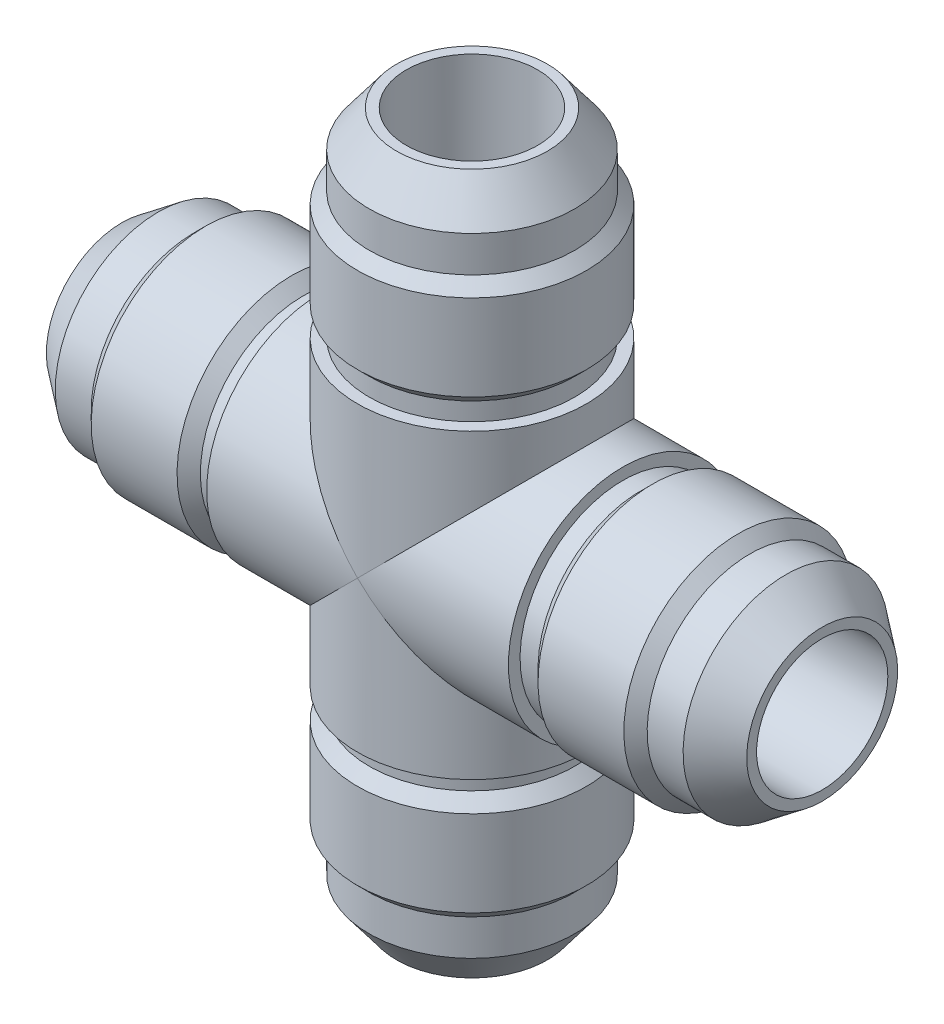
ISO-10303-21;
HEADER;
FILE_DESCRIPTION(('STEP AP214'),'2;1');
FILE_NAME('part.step','',(''),(''),'','','');
FILE_SCHEMA(('AUTOMOTIVE_DESIGN { 1 0 10303 214 1 1 1 1 }'));
ENDSEC;
DATA;
#1=APPLICATION_CONTEXT('core data for automotive mechanical design processes');
#2=APPLICATION_PROTOCOL_DEFINITION('international standard','automotive_design',2000,#1);
#3=PRODUCT_CONTEXT('',#1,'mechanical');
#4=PRODUCT('Part','Part','',(#3));
#5=PRODUCT_RELATED_PRODUCT_CATEGORY('part','',(#4));
#6=PRODUCT_DEFINITION_FORMATION('','',#4);
#7=PRODUCT_DEFINITION_CONTEXT('part definition',#1,'design');
#8=PRODUCT_DEFINITION('design','',#6,#7);
#9=PRODUCT_DEFINITION_SHAPE('','',#8);
#10=(LENGTH_UNIT() NAMED_UNIT(*) SI_UNIT(.MILLI.,.METRE.));
#11=(NAMED_UNIT(*) PLANE_ANGLE_UNIT() SI_UNIT($,.RADIAN.));
#12=(NAMED_UNIT(*) SI_UNIT($,.STERADIAN.) SOLID_ANGLE_UNIT());
#13=UNCERTAINTY_MEASURE_WITH_UNIT(LENGTH_MEASURE(1.E-05),#10,'distance_accuracy_value','');
#14=(GEOMETRIC_REPRESENTATION_CONTEXT(3) GLOBAL_UNCERTAINTY_ASSIGNED_CONTEXT((#13)) GLOBAL_UNIT_ASSIGNED_CONTEXT((#10,
#11,#12)) REPRESENTATION_CONTEXT('',''));
#15=CARTESIAN_POINT('',(0.,0.,0.));
#16=DIRECTION('',(0.,0.,1.));
#17=DIRECTION('',(1.,0.,0.));
#18=AXIS2_PLACEMENT_3D('',#15,#16,#17);
#19=CARTESIAN_POINT('',(41.275,0.,0.));
#20=DIRECTION('',(-1.,0.,0.));
#21=DIRECTION('',(0.,0.,1.));
#22=AXIS2_PLACEMENT_3D('',#19,#20,#21);
#23=CYLINDRICAL_SURFACE('',#22,7.7343);
#24=CARTESIAN_POINT('',(-41.275,0.,0.));
#25=DIRECTION('',(1.,0.,0.));
#26=DIRECTION('',(0.,0.,-1.));
#27=AXIS2_PLACEMENT_3D('',#24,#25,#26);
#28=CIRCLE('',#27,7.7343);
#29=CARTESIAN_POINT('',(-41.275,0.,-7.7343));
#30=VERTEX_POINT('',#29);
#31=EDGE_CURVE('E143',#30,#30,#28,.T.);
#32=ORIENTED_EDGE('',*,*,#31,.F.);
#33=EDGE_LOOP('',(#32));
#34=FACE_BOUND('',#33,.T.);
#35=CARTESIAN_POINT('',(0.,0.,0.));
#36=DIRECTION('',(-0.707106781186549,-0.707106781186546,0.));
#37=DIRECTION('',(-0.707106781186546,0.707106781186549,0.));
#38=AXIS2_PLACEMENT_3D('',#35,#36,#37);
#39=ELLIPSE('',#38,10.9379519554622,7.7343);
#40=CARTESIAN_POINT('',(1.44913832121401E-13,0.,-7.7343));
#41=VERTEX_POINT('',#40);
#42=CARTESIAN_POINT('',(0.,0.,7.7343));
#43=VERTEX_POINT('',#42);
#44=EDGE_CURVE('E73',#41,#43,#39,.F.);
#45=ORIENTED_EDGE('',*,*,#44,.T.);
#46=CARTESIAN_POINT('',(1.44913832121401E-13,0.,0.));
#47=DIRECTION('',(-0.707106781186547,0.707106781186547,0.));
#48=DIRECTION('',(-0.707106781186547,-0.707106781186547,0.));
#49=AXIS2_PLACEMENT_3D('',#46,#47,#48);
#50=ELLIPSE('',#49,10.9379519554622,7.7343);
#51=EDGE_CURVE('E11',#43,#41,#50,.F.);
#52=ORIENTED_EDGE('',*,*,#51,.T.);
#53=EDGE_LOOP('',(#45,#52));
#54=FACE_BOUND('',#53,.T.);
#55=ADVANCED_FACE('F42',(#34,#54),#23,.F.);
#56=CARTESIAN_POINT('',(0.,0.,0.));
#57=DIRECTION('',(0.,1.,0.));
#58=DIRECTION('',(0.,0.,1.));
#59=AXIS2_PLACEMENT_3D('',#56,#57,#58);
#60=CYLINDRICAL_SURFACE('',#59,13.49375);
#61=CARTESIAN_POINT('',(0.,17.78,0.));
#62=DIRECTION('',(0.,-1.,0.));
#63=DIRECTION('',(0.,0.,-1.));
#64=AXIS2_PLACEMENT_3D('',#61,#62,#63);
#65=CIRCLE('',#64,13.49375);
#66=CARTESIAN_POINT('',(0.,17.78,-13.49375));
#67=VERTEX_POINT('',#66);
#68=EDGE_CURVE('E176',#67,#67,#65,.T.);
#69=ORIENTED_EDGE('',*,*,#68,.T.);
#70=EDGE_LOOP('',(#69));
#71=FACE_BOUND('',#70,.T.);
#72=CARTESIAN_POINT('',(0.,0.,0.));
#73=DIRECTION('',(-0.707106781186546,0.707106781186549,0.));
#74=DIRECTION('',(0.707106781186549,0.707106781186546,0.));
#75=AXIS2_PLACEMENT_3D('',#72,#73,#74);
#76=ELLIPSE('',#75,19.083044257272,13.49375);
#77=CARTESIAN_POINT('',(0.,0.,-13.49375));
#78=VERTEX_POINT('',#77);
#79=CARTESIAN_POINT('',(0.,0.,13.49375));
#80=VERTEX_POINT('',#79);
#81=EDGE_CURVE('E171',#78,#80,#76,.F.);
#82=ORIENTED_EDGE('',*,*,#81,.F.);
#83=CARTESIAN_POINT('',(0.,0.,0.));
#84=DIRECTION('',(0.707106781186549,0.707106781186546,0.));
#85=DIRECTION('',(-0.707106781186546,0.707106781186549,0.));
#86=AXIS2_PLACEMENT_3D('',#83,#84,#85);
#87=ELLIPSE('',#86,19.0830442572719,13.49375);
#88=EDGE_CURVE('E61',#80,#78,#87,.F.);
#89=ORIENTED_EDGE('',*,*,#88,.F.);
#90=EDGE_LOOP('',(#82,#89));
#91=FACE_BOUND('',#90,.T.);
#92=ADVANCED_FACE('F226',(#71,#91),#60,.T.);
#93=CARTESIAN_POINT('',(1.4411089226075E-13,41.275,0.));
#94=DIRECTION('',(0.,-1.,0.));
#95=DIRECTION('',(0.,0.,-1.));
#96=AXIS2_PLACEMENT_3D('',#93,#94,#95);
#97=CYLINDRICAL_SURFACE('',#96,7.7343);
#98=CARTESIAN_POINT('',(1.4411089226075E-13,41.275,0.));
#99=DIRECTION('',(0.,-1.,0.));
#100=DIRECTION('',(0.,0.,-1.));
#101=AXIS2_PLACEMENT_3D('',#98,#99,#100);
#102=CIRCLE('',#101,7.7343);
#103=CARTESIAN_POINT('',(1.4411089226075E-13,41.275,-7.7343));
#104=VERTEX_POINT('',#103);
#105=EDGE_CURVE('E173',#104,#104,#102,.T.);
#106=ORIENTED_EDGE('',*,*,#105,.F.);
#107=EDGE_LOOP('',(#106));
#108=FACE_BOUND('',#107,.T.);
#109=ORIENTED_EDGE('',*,*,#44,.F.);
#110=CARTESIAN_POINT('',(0.,0.,0.));
#111=DIRECTION('',(-0.707106781186546,0.707106781186549,0.));
#112=DIRECTION('',(-0.707106781186549,-0.707106781186546,0.));
#113=AXIS2_PLACEMENT_3D('',#110,#111,#112);
#114=ELLIPSE('',#113,10.9379519554622,7.7343);
#115=EDGE_CURVE('E77',#43,#41,#114,.T.);
#116=ORIENTED_EDGE('',*,*,#115,.F.);
#117=EDGE_LOOP('',(#109,#116));
#118=FACE_BOUND('',#117,.T.);
#119=ADVANCED_FACE('F76',(#108,#118),#97,.F.);
#120=CARTESIAN_POINT('',(0.,17.78,0.));
#121=DIRECTION('',(0.,1.,0.));
#122=DIRECTION('',(0.,0.,1.));
#123=AXIS2_PLACEMENT_3D('',#120,#121,#122);
#124=CYLINDRICAL_SURFACE('',#123,13.49375);
#125=CARTESIAN_POINT('',(0.,21.2714819951745,0.));
#126=DIRECTION('',(0.,-1.,0.));
#127=DIRECTION('',(1.,0.,0.));
#128=AXIS2_PLACEMENT_3D('',#125,#126,#127);
#129=CIRCLE('',#128,13.49375);
#130=CARTESIAN_POINT('',(13.4937500000001,21.2714819951744,0.));
#131=VERTEX_POINT('',#130);
#132=EDGE_CURVE('E179',#131,#131,#129,.T.);
#133=ORIENTED_EDGE('',*,*,#132,.F.);
#134=EDGE_LOOP('',(#133));
#135=FACE_BOUND('',#134,.T.);
#136=CARTESIAN_POINT('',(1.0652756648338E-13,31.3878090172366,0.));
#137=DIRECTION('',(0.,-1.,0.));
#138=DIRECTION('',(1.,0.,0.));
#139=AXIS2_PLACEMENT_3D('',#136,#137,#138);
#140=CIRCLE('',#139,13.49375);
#141=CARTESIAN_POINT('',(13.4937500000001,31.3878090172366,0.));
#142=VERTEX_POINT('',#141);
#143=EDGE_CURVE('E188',#142,#142,#140,.T.);
#144=ORIENTED_EDGE('',*,*,#143,.T.);
#145=EDGE_LOOP('',(#144));
#146=FACE_BOUND('',#145,.T.);
#147=ADVANCED_FACE('F44',(#135,#146),#124,.T.);
#148=CARTESIAN_POINT('',(1.11193573315191E-13,32.7626243457444,0.));
#149=DIRECTION('',(0.,-1.,0.));
#150=DIRECTION('',(1.,0.,0.));
#151=AXIS2_PLACEMENT_3D('',#148,#149,#150);
#152=CONICAL_SURFACE('',#151,12.1189346714922,0.78539816339745);
#153=ORIENTED_EDGE('',*,*,#143,.F.);
#154=EDGE_LOOP('',(#153));
#155=FACE_BOUND('',#154,.T.);
#156=CARTESIAN_POINT('',(1.11193573315191E-13,32.7626243457444,0.));
#157=DIRECTION('',(0.,-1.,0.));
#158=DIRECTION('',(1.,0.,0.));
#159=AXIS2_PLACEMENT_3D('',#156,#157,#158);
#160=CIRCLE('',#159,12.1189346714922);
#161=CARTESIAN_POINT('',(12.1189346714923,32.7626243457444,0.));
#162=VERTEX_POINT('',#161);
#163=EDGE_CURVE('E70',#162,#162,#160,.T.);
#164=ORIENTED_EDGE('',*,*,#163,.T.);
#165=EDGE_LOOP('',(#164));
#166=FACE_BOUND('',#165,.T.);
#167=ADVANCED_FACE('F200',(#155,#166),#152,.T.);
#168=CARTESIAN_POINT('',(0.,0.,0.));
#169=DIRECTION('',(0.,-1.,0.));
#170=DIRECTION('',(1.,0.,0.));
#171=AXIS2_PLACEMENT_3D('',#168,#169,#170);
#172=CYLINDRICAL_SURFACE('',#171,12.1189346714922);
#173=ORIENTED_EDGE('',*,*,#163,.F.);
#174=EDGE_LOOP('',(#173));
#175=FACE_BOUND('',#174,.T.);
#176=CARTESIAN_POINT('',(1.25561148250585E-13,36.9959576790777,0.));
#177=DIRECTION('',(0.,-1.,0.));
#178=DIRECTION('',(1.,0.,0.));
#179=AXIS2_PLACEMENT_3D('',#176,#177,#178);
#180=CIRCLE('',#179,12.1189346714922);
#181=CARTESIAN_POINT('',(12.1189346714923,36.9959576790777,0.));
#182=VERTEX_POINT('',#181);
#183=EDGE_CURVE('E194',#182,#182,#180,.T.);
#184=ORIENTED_EDGE('',*,*,#183,.T.);
#185=EDGE_LOOP('',(#184));
#186=FACE_BOUND('',#185,.T.);
#187=ADVANCED_FACE('F202',(#175,#186),#172,.T.);
#188=CARTESIAN_POINT('',(1.4008385562009E-13,41.275,0.));
#189=DIRECTION('',(0.,-1.,0.));
#190=DIRECTION('',(1.,0.,0.));
#191=AXIS2_PLACEMENT_3D('',#188,#189,#190);
#192=CONICAL_SURFACE('',#191,8.894445,0.645771823237897);
#193=ORIENTED_EDGE('',*,*,#183,.F.);
#194=EDGE_LOOP('',(#193));
#195=FACE_BOUND('',#194,.T.);
#196=CARTESIAN_POINT('',(1.4008385562009E-13,41.275,0.));
#197=DIRECTION('',(0.,-1.,0.));
#198=DIRECTION('',(1.,0.,0.));
#199=AXIS2_PLACEMENT_3D('',#196,#197,#198);
#200=CIRCLE('',#199,8.894445);
#201=CARTESIAN_POINT('',(8.89444500000014,41.275,0.));
#202=VERTEX_POINT('',#201);
#203=EDGE_CURVE('E191',#202,#202,#200,.T.);
#204=ORIENTED_EDGE('',*,*,#203,.T.);
#205=EDGE_LOOP('',(#204));
#206=FACE_BOUND('',#205,.T.);
#207=ADVANCED_FACE('F205',(#195,#206),#192,.T.);
#208=CARTESIAN_POINT('',(1.4411089226075E-13,41.275,0.));
#209=DIRECTION('',(0.,-1.,0.));
#210=DIRECTION('',(0.,0.,-1.));
#211=AXIS2_PLACEMENT_3D('',#208,#209,#210);
#212=PLANE('',#211);
#213=ORIENTED_EDGE('',*,*,#105,.T.);
#214=EDGE_LOOP('',(#213));
#215=FACE_BOUND('',#214,.T.);
#216=ORIENTED_EDGE('',*,*,#203,.F.);
#217=EDGE_LOOP('',(#216));
#218=FACE_BOUND('',#217,.T.);
#219=ADVANCED_FACE('F211',(#215,#218),#212,.F.);
#220=CARTESIAN_POINT('',(0.,0.,0.));
#221=DIRECTION('',(0.,-1.,0.));
#222=DIRECTION('',(1.,0.,0.));
#223=AXIS2_PLACEMENT_3D('',#220,#221,#222);
#224=CYLINDRICAL_SURFACE('',#223,12.1189346714922);
#225=CARTESIAN_POINT('',(0.,17.78,0.));
#226=DIRECTION('',(0.,-1.,0.));
#227=DIRECTION('',(1.,0.,0.));
#228=AXIS2_PLACEMENT_3D('',#225,#226,#227);
#229=CIRCLE('',#228,12.1189346714922);
#230=CARTESIAN_POINT('',(12.1189346714922,17.78,0.));
#231=VERTEX_POINT('',#230);
#232=EDGE_CURVE('E185',#231,#231,#229,.T.);
#233=ORIENTED_EDGE('',*,*,#232,.F.);
#234=EDGE_LOOP('',(#233));
#235=FACE_BOUND('',#234,.T.);
#236=CARTESIAN_POINT('',(0.,19.8966666666667,0.));
#237=DIRECTION('',(0.,-1.,0.));
#238=DIRECTION('',(1.,0.,0.));
#239=AXIS2_PLACEMENT_3D('',#236,#237,#238);
#240=CIRCLE('',#239,12.1189346714922);
#241=CARTESIAN_POINT('',(12.1189346714922,19.8966666666666,0.));
#242=VERTEX_POINT('',#241);
#243=EDGE_CURVE('E182',#242,#242,#240,.T.);
#244=ORIENTED_EDGE('',*,*,#243,.T.);
#245=EDGE_LOOP('',(#244));
#246=FACE_BOUND('',#245,.T.);
#247=ADVANCED_FACE('F216',(#235,#246),#224,.T.);
#248=CARTESIAN_POINT('',(0.,21.2714819951745,0.));
#249=DIRECTION('',(0.,1.,0.));
#250=DIRECTION('',(-1.,0.,0.));
#251=AXIS2_PLACEMENT_3D('',#248,#249,#250);
#252=CONICAL_SURFACE('',#251,13.49375,0.78539816339745);
#253=ORIENTED_EDGE('',*,*,#243,.F.);
#254=EDGE_LOOP('',(#253));
#255=FACE_BOUND('',#254,.T.);
#256=ORIENTED_EDGE('',*,*,#132,.T.);
#257=EDGE_LOOP('',(#256));
#258=FACE_BOUND('',#257,.T.);
#259=ADVANCED_FACE('F221',(#255,#258),#252,.T.);
#260=CARTESIAN_POINT('',(0.,17.78,0.));
#261=DIRECTION('',(0.,-1.,0.));
#262=DIRECTION('',(0.,0.,-1.));
#263=AXIS2_PLACEMENT_3D('',#260,#261,#262);
#264=PLANE('',#263);
#265=ORIENTED_EDGE('',*,*,#68,.F.);
#266=EDGE_LOOP('',(#265));
#267=FACE_BOUND('',#266,.T.);
#268=ORIENTED_EDGE('',*,*,#232,.T.);
#269=EDGE_LOOP('',(#268));
#270=FACE_BOUND('',#269,.T.);
#271=ADVANCED_FACE('F455',(#267,#270),#264,.F.);
#272=CARTESIAN_POINT('',(-1.82766167661939E-13,-17.78,0.));
#273=DIRECTION('',(0.,1.,0.));
#274=DIRECTION('',(0.,0.,-1.));
#275=AXIS2_PLACEMENT_3D('',#272,#273,#274);
#276=PLANE('',#275);
#277=CARTESIAN_POINT('',(-1.82766167661939E-13,-17.78,0.));
#278=DIRECTION('',(0.,1.,0.));
#279=DIRECTION('',(0.,0.,-1.));
#280=AXIS2_PLACEMENT_3D('',#277,#278,#279);
#281=CIRCLE('',#280,13.49375);
#282=CARTESIAN_POINT('',(-1.82766167661939E-13,-17.78,-13.49375));
#283=VERTEX_POINT('',#282);
#284=EDGE_CURVE('E84',#283,#283,#281,.T.);
#285=ORIENTED_EDGE('',*,*,#284,.F.);
#286=EDGE_LOOP('',(#285));
#287=FACE_BOUND('',#286,.T.);
#288=CARTESIAN_POINT('',(-1.84500891137916E-13,-17.78,0.));
#289=DIRECTION('',(0.,1.,0.));
#290=DIRECTION('',(-1.,0.,0.));
#291=AXIS2_PLACEMENT_3D('',#288,#289,#290);
#292=CIRCLE('',#291,12.1189346714922);
#293=CARTESIAN_POINT('',(-12.1189346714924,-17.7799999999999,0.));
#294=VERTEX_POINT('',#293);
#295=EDGE_CURVE('E95',#294,#294,#292,.T.);
#296=ORIENTED_EDGE('',*,*,#295,.T.);
#297=EDGE_LOOP('',(#296));
#298=FACE_BOUND('',#297,.T.);
#299=ADVANCED_FACE('F465',(#287,#298),#276,.F.);
#300=CARTESIAN_POINT('',(-2.2073157389954E-13,-21.2714819951745,0.));
#301=DIRECTION('',(0.,-1.,0.));
#302=DIRECTION('',(1.,0.,0.));
#303=AXIS2_PLACEMENT_3D('',#300,#301,#302);
#304=CONICAL_SURFACE('',#303,13.49375,0.78539816339745);
#305=CARTESIAN_POINT('',(-2.06465282940049E-13,-19.8966666666667,0.));
#306=DIRECTION('',(0.,1.,0.));
#307=DIRECTION('',(-1.,0.,0.));
#308=AXIS2_PLACEMENT_3D('',#305,#306,#307);
#309=CIRCLE('',#308,12.1189346714922);
#310=CARTESIAN_POINT('',(-12.1189346714924,-19.8966666666665,0.));
#311=VERTEX_POINT('',#310);
#312=EDGE_CURVE('E92',#311,#311,#309,.T.);
#313=ORIENTED_EDGE('',*,*,#312,.F.);
#314=EDGE_LOOP('',(#313));
#315=FACE_BOUND('',#314,.T.);
#316=CARTESIAN_POINT('',(-2.2073157389954E-13,-21.2714819951745,0.));
#317=DIRECTION('',(0.,1.,0.));
#318=DIRECTION('',(-1.,0.,0.));
#319=AXIS2_PLACEMENT_3D('',#316,#317,#318);
#320=CIRCLE('',#319,13.49375);
#321=CARTESIAN_POINT('',(-13.4937500000002,-21.2714819951743,0.));
#322=VERTEX_POINT('',#321);
#323=EDGE_CURVE('E89',#322,#322,#320,.T.);
#324=ORIENTED_EDGE('',*,*,#323,.T.);
#325=EDGE_LOOP('',(#324));
#326=FACE_BOUND('',#325,.T.);
#327=ADVANCED_FACE('F482',(#315,#326),#304,.T.);
#328=CARTESIAN_POINT('',(0.,0.,0.));
#329=DIRECTION('',(0.,1.,0.));
#330=DIRECTION('',(-1.,0.,0.));
#331=AXIS2_PLACEMENT_3D('',#328,#329,#330);
#332=CYLINDRICAL_SURFACE('',#331,12.1189346714922);
#333=ORIENTED_EDGE('',*,*,#295,.F.);
#334=EDGE_LOOP('',(#333));
#335=FACE_BOUND('',#334,.T.);
#336=ORIENTED_EDGE('',*,*,#312,.T.);
#337=EDGE_LOOP('',(#336));
#338=FACE_BOUND('',#337,.T.);
#339=ADVANCED_FACE('F491',(#335,#338),#332,.T.);
#340=CARTESIAN_POINT('',(-4.32332676782251E-13,-41.275,0.));
#341=DIRECTION('',(0.,1.,0.));
#342=DIRECTION('',(0.,0.,-1.));
#343=AXIS2_PLACEMENT_3D('',#340,#341,#342);
#344=PLANE('',#343);
#345=CARTESIAN_POINT('',(-4.32332676782251E-13,-41.275,0.));
#346=DIRECTION('',(0.,1.,0.));
#347=DIRECTION('',(0.,0.,-1.));
#348=AXIS2_PLACEMENT_3D('',#345,#346,#347);
#349=CIRCLE('',#348,7.7343);
#350=CARTESIAN_POINT('',(-4.32332676782251E-13,-41.275,-7.7343));
#351=VERTEX_POINT('',#350);
#352=EDGE_CURVE('E81',#351,#351,#349,.T.);
#353=ORIENTED_EDGE('',*,*,#352,.T.);
#354=EDGE_LOOP('',(#353));
#355=FACE_BOUND('',#354,.T.);
#356=CARTESIAN_POINT('',(-4.2830564014159E-13,-41.275,0.));
#357=DIRECTION('',(0.,1.,0.));
#358=DIRECTION('',(-1.,0.,0.));
#359=AXIS2_PLACEMENT_3D('',#356,#357,#358);
#360=CIRCLE('',#359,8.894445);
#361=CARTESIAN_POINT('',(-8.89444500000043,-41.2749999999999,0.));
#362=VERTEX_POINT('',#361);
#363=EDGE_CURVE('E101',#362,#362,#360,.T.);
#364=ORIENTED_EDGE('',*,*,#363,.F.);
#365=EDGE_LOOP('',(#364));
#366=FACE_BOUND('',#365,.T.);
#367=ADVANCED_FACE('F501',(#355,#366),#344,.F.);
#368=CARTESIAN_POINT('',(-4.2830564014159E-13,-41.275,0.));
#369=DIRECTION('',(0.,1.,0.));
#370=DIRECTION('',(-1.,0.,0.));
#371=AXIS2_PLACEMENT_3D('',#368,#369,#370);
#372=CONICAL_SURFACE('',#371,8.894445,0.645771823237897);
#373=CARTESIAN_POINT('',(-3.83902539948845E-13,-36.9959576790777,0.));
#374=DIRECTION('',(0.,1.,0.));
#375=DIRECTION('',(-1.,0.,0.));
#376=AXIS2_PLACEMENT_3D('',#373,#374,#375);
#377=CIRCLE('',#376,12.1189346714922);
#378=CARTESIAN_POINT('',(-12.1189346714926,-36.9959576790776,0.));
#379=VERTEX_POINT('',#378);
#380=EDGE_CURVE('E104',#379,#379,#377,.T.);
#381=ORIENTED_EDGE('',*,*,#380,.F.);
#382=EDGE_LOOP('',(#381));
#383=FACE_BOUND('',#382,.T.);
#384=ORIENTED_EDGE('',*,*,#363,.T.);
#385=EDGE_LOOP('',(#384));
#386=FACE_BOUND('',#385,.T.);
#387=ADVANCED_FACE('F511',(#383,#386),#372,.T.);
#388=CARTESIAN_POINT('',(0.,0.,0.));
#389=DIRECTION('',(0.,1.,0.));
#390=DIRECTION('',(-1.,0.,0.));
#391=AXIS2_PLACEMENT_3D('',#388,#389,#390);
#392=CYLINDRICAL_SURFACE('',#391,12.1189346714922);
#393=CARTESIAN_POINT('',(-3.3997375634458E-13,-32.7626243457444,0.));
#394=DIRECTION('',(0.,1.,0.));
#395=DIRECTION('',(-1.,0.,0.));
#396=AXIS2_PLACEMENT_3D('',#393,#394,#395);
#397=CIRCLE('',#396,12.1189346714922);
#398=CARTESIAN_POINT('',(-12.1189346714925,-32.7626243457443,0.));
#399=VERTEX_POINT('',#398);
#400=EDGE_CURVE('E107',#399,#399,#397,.T.);
#401=ORIENTED_EDGE('',*,*,#400,.F.);
#402=EDGE_LOOP('',(#401));
#403=FACE_BOUND('',#402,.T.);
#404=ORIENTED_EDGE('',*,*,#380,.T.);
#405=EDGE_LOOP('',(#404));
#406=FACE_BOUND('',#405,.T.);
#407=ADVANCED_FACE('F521',(#403,#406),#392,.T.);
#408=CARTESIAN_POINT('',(-3.3997375634458E-13,-32.7626243457444,0.));
#409=DIRECTION('',(0.,1.,0.));
#410=DIRECTION('',(-1.,0.,0.));
#411=AXIS2_PLACEMENT_3D('',#408,#409,#410);
#412=CONICAL_SURFACE('',#411,12.1189346714922,0.78539816339745);
#413=CARTESIAN_POINT('',(-3.25707465385088E-13,-31.3878090172366,0.));
#414=DIRECTION('',(0.,1.,0.));
#415=DIRECTION('',(-1.,0.,0.));
#416=AXIS2_PLACEMENT_3D('',#413,#414,#415);
#417=CIRCLE('',#416,13.49375);
#418=CARTESIAN_POINT('',(-13.4937500000003,-31.3878090172365,0.));
#419=VERTEX_POINT('',#418);
#420=EDGE_CURVE('E98',#419,#419,#417,.T.);
#421=ORIENTED_EDGE('',*,*,#420,.F.);
#422=EDGE_LOOP('',(#421));
#423=FACE_BOUND('',#422,.T.);
#424=ORIENTED_EDGE('',*,*,#400,.T.);
#425=EDGE_LOOP('',(#424));
#426=FACE_BOUND('',#425,.T.);
#427=ADVANCED_FACE('F531',(#423,#426),#412,.T.);
#428=CARTESIAN_POINT('',(-1.86235614613893E-13,-17.78,0.));
#429=DIRECTION('',(0.,-1.,0.));
#430=DIRECTION('',(0.,0.,1.));
#431=AXIS2_PLACEMENT_3D('',#428,#429,#430);
#432=CYLINDRICAL_SURFACE('',#431,13.49375);
#433=ORIENTED_EDGE('',*,*,#323,.F.);
#434=EDGE_LOOP('',(#433));
#435=FACE_BOUND('',#434,.T.);
#436=ORIENTED_EDGE('',*,*,#420,.T.);
#437=EDGE_LOOP('',(#436));
#438=FACE_BOUND('',#437,.T.);
#439=ADVANCED_FACE('F541',(#435,#438),#432,.T.);
#440=CARTESIAN_POINT('',(17.78,-1.20687629457308E-13,0.));
#441=DIRECTION('',(-1.,0.,0.));
#442=DIRECTION('',(0.,0.,-1.));
#443=AXIS2_PLACEMENT_3D('',#440,#441,#442);
#444=PLANE('',#443);
#445=CARTESIAN_POINT('',(17.78,-1.20687629457308E-13,0.));
#446=DIRECTION('',(-1.,0.,0.));
#447=DIRECTION('',(0.,0.,-1.));
#448=AXIS2_PLACEMENT_3D('',#445,#446,#447);
#449=CIRCLE('',#448,13.49375);
#450=CARTESIAN_POINT('',(17.78,-1.20687629457308E-13,-13.49375));
#451=VERTEX_POINT('',#450);
#452=EDGE_CURVE('E116',#451,#451,#449,.T.);
#453=ORIENTED_EDGE('',*,*,#452,.F.);
#454=EDGE_LOOP('',(#453));
#455=FACE_BOUND('',#454,.T.);
#456=CARTESIAN_POINT('',(17.78,-1.22422352933285E-13,0.));
#457=DIRECTION('',(-1.,0.,0.));
#458=DIRECTION('',(0.,-1.,0.));
#459=AXIS2_PLACEMENT_3D('',#456,#457,#458);
#460=CIRCLE('',#459,12.1189346714922);
#461=CARTESIAN_POINT('',(17.7799999999999,-12.1189346714923,0.));
#462=VERTEX_POINT('',#461);
#463=EDGE_CURVE('E125',#462,#462,#460,.T.);
#464=ORIENTED_EDGE('',*,*,#463,.T.);
#465=EDGE_LOOP('',(#464));
#466=FACE_BOUND('',#465,.T.);
#467=ADVANCED_FACE('F551',(#455,#466),#444,.F.);
#468=CARTESIAN_POINT('',(21.2714819951745,-1.46462591463851E-13,0.));
#469=DIRECTION('',(1.,0.,0.));
#470=DIRECTION('',(0.,1.,0.));
#471=AXIS2_PLACEMENT_3D('',#468,#469,#470);
#472=CONICAL_SURFACE('',#471,13.49375,0.78539816339745);
#473=CARTESIAN_POINT('',(19.8966666666667,-1.369964425682E-13,0.));
#474=DIRECTION('',(-1.,0.,0.));
#475=DIRECTION('',(0.,-1.,0.));
#476=AXIS2_PLACEMENT_3D('',#473,#474,#475);
#477=CIRCLE('',#476,12.1189346714922);
#478=CARTESIAN_POINT('',(19.8966666666666,-12.1189346714923,0.));
#479=VERTEX_POINT('',#478);
#480=EDGE_CURVE('E122',#479,#479,#477,.T.);
#481=ORIENTED_EDGE('',*,*,#480,.F.);
#482=EDGE_LOOP('',(#481));
#483=FACE_BOUND('',#482,.T.);
#484=CARTESIAN_POINT('',(21.2714819951745,-1.46462591463851E-13,0.));
#485=DIRECTION('',(-1.,0.,0.));
#486=DIRECTION('',(0.,-1.,0.));
#487=AXIS2_PLACEMENT_3D('',#484,#485,#486);
#488=CIRCLE('',#487,13.49375);
#489=CARTESIAN_POINT('',(21.2714819951744,-13.4937500000001,0.));
#490=VERTEX_POINT('',#489);
#491=EDGE_CURVE('E119',#490,#490,#488,.T.);
#492=ORIENTED_EDGE('',*,*,#491,.T.);
#493=EDGE_LOOP('',(#492));
#494=FACE_BOUND('',#493,.T.);
#495=ADVANCED_FACE('F561',(#483,#494),#472,.T.);
#496=CARTESIAN_POINT('',(0.,0.,0.));
#497=DIRECTION('',(-1.,0.,0.));
#498=DIRECTION('',(0.,-1.,0.));
#499=AXIS2_PLACEMENT_3D('',#496,#497,#498);
#500=CYLINDRICAL_SURFACE('',#499,12.1189346714922);
#501=ORIENTED_EDGE('',*,*,#463,.F.);
#502=EDGE_LOOP('',(#501));
#503=FACE_BOUND('',#502,.T.);
#504=ORIENTED_EDGE('',*,*,#480,.T.);
#505=EDGE_LOOP('',(#504));
#506=FACE_BOUND('',#505,.T.);
#507=ADVANCED_FACE('F571',(#503,#506),#500,.T.);
#508=CARTESIAN_POINT('',(41.275,-2.88221784521501E-13,0.));
#509=DIRECTION('',(-1.,0.,0.));
#510=DIRECTION('',(0.,0.,-1.));
#511=AXIS2_PLACEMENT_3D('',#508,#509,#510);
#512=PLANE('',#511);
#513=CARTESIAN_POINT('',(41.275,-2.88221784521501E-13,0.));
#514=DIRECTION('',(-1.,0.,0.));
#515=DIRECTION('',(0.,0.,-1.));
#516=AXIS2_PLACEMENT_3D('',#513,#514,#515);
#517=CIRCLE('',#516,7.7343);
#518=CARTESIAN_POINT('',(41.275,-2.88221784521501E-13,-7.7343));
#519=VERTEX_POINT('',#518);
#520=EDGE_CURVE('E113',#519,#519,#517,.T.);
#521=ORIENTED_EDGE('',*,*,#520,.T.);
#522=EDGE_LOOP('',(#521));
#523=FACE_BOUND('',#522,.T.);
#524=CARTESIAN_POINT('',(41.275,-2.8419474788084E-13,0.));
#525=DIRECTION('',(-1.,0.,0.));
#526=DIRECTION('',(0.,-1.,0.));
#527=AXIS2_PLACEMENT_3D('',#524,#525,#526);
#528=CIRCLE('',#527,8.894445);
#529=CARTESIAN_POINT('',(41.2749999999999,-8.89444500000029,0.));
#530=VERTEX_POINT('',#529);
#531=EDGE_CURVE('E131',#530,#530,#528,.T.);
#532=ORIENTED_EDGE('',*,*,#531,.F.);
#533=EDGE_LOOP('',(#532));
#534=FACE_BOUND('',#533,.T.);
#535=ADVANCED_FACE('F581',(#523,#534),#512,.F.);
#536=CARTESIAN_POINT('',(41.275,-2.8419474788084E-13,0.));
#537=DIRECTION('',(-1.,0.,0.));
#538=DIRECTION('',(0.,-1.,0.));
#539=AXIS2_PLACEMENT_3D('',#536,#537,#538);
#540=CONICAL_SURFACE('',#539,8.894445,0.645771823237897);
#541=CARTESIAN_POINT('',(36.9959576790777,-2.54731844099715E-13,0.));
#542=DIRECTION('',(-1.,0.,0.));
#543=DIRECTION('',(0.,-1.,0.));
#544=AXIS2_PLACEMENT_3D('',#541,#542,#543);
#545=CIRCLE('',#544,12.1189346714922);
#546=CARTESIAN_POINT('',(36.9959576790777,-12.1189346714924,0.));
#547=VERTEX_POINT('',#546);
#548=EDGE_CURVE('E134',#547,#547,#545,.T.);
#549=ORIENTED_EDGE('',*,*,#548,.F.);
#550=EDGE_LOOP('',(#549));
#551=FACE_BOUND('',#550,.T.);
#552=ORIENTED_EDGE('',*,*,#531,.T.);
#553=EDGE_LOOP('',(#552));
#554=FACE_BOUND('',#553,.T.);
#555=ADVANCED_FACE('F591',(#551,#554),#540,.T.);
#556=CARTESIAN_POINT('',(0.,0.,0.));
#557=DIRECTION('',(-1.,0.,0.));
#558=DIRECTION('',(0.,-1.,0.));
#559=AXIS2_PLACEMENT_3D('',#556,#557,#558);
#560=CYLINDRICAL_SURFACE('',#559,12.1189346714922);
#561=CARTESIAN_POINT('',(32.7626243457444,-2.25583664829885E-13,0.));
#562=DIRECTION('',(-1.,0.,0.));
#563=DIRECTION('',(0.,-1.,0.));
#564=AXIS2_PLACEMENT_3D('',#561,#562,#563);
#565=CIRCLE('',#564,12.1189346714922);
#566=CARTESIAN_POINT('',(32.7626243457443,-12.1189346714924,0.));
#567=VERTEX_POINT('',#566);
#568=EDGE_CURVE('E137',#567,#567,#565,.T.);
#569=ORIENTED_EDGE('',*,*,#568,.F.);
#570=EDGE_LOOP('',(#569));
#571=FACE_BOUND('',#570,.T.);
#572=ORIENTED_EDGE('',*,*,#548,.T.);
#573=EDGE_LOOP('',(#572));
#574=FACE_BOUND('',#573,.T.);
#575=ADVANCED_FACE('F601',(#571,#574),#560,.T.);
#576=CARTESIAN_POINT('',(32.7626243457444,-2.25583664829885E-13,0.));
#577=DIRECTION('',(-1.,0.,0.));
#578=DIRECTION('',(0.,-1.,0.));
#579=AXIS2_PLACEMENT_3D('',#576,#577,#578);
#580=CONICAL_SURFACE('',#579,12.1189346714922,0.78539816339745);
#581=CARTESIAN_POINT('',(31.3878090172366,-2.16117515934234E-13,0.));
#582=DIRECTION('',(-1.,0.,0.));
#583=DIRECTION('',(0.,-1.,0.));
#584=AXIS2_PLACEMENT_3D('',#581,#582,#583);
#585=CIRCLE('',#584,13.49375);
#586=CARTESIAN_POINT('',(31.3878090172365,-13.4937500000002,0.));
#587=VERTEX_POINT('',#586);
#588=EDGE_CURVE('E128',#587,#587,#585,.T.);
#589=ORIENTED_EDGE('',*,*,#588,.F.);
#590=EDGE_LOOP('',(#589));
#591=FACE_BOUND('',#590,.T.);
#592=ORIENTED_EDGE('',*,*,#568,.T.);
#593=EDGE_LOOP('',(#592));
#594=FACE_BOUND('',#593,.T.);
#595=ADVANCED_FACE('F611',(#591,#594),#580,.T.);
#596=CARTESIAN_POINT('',(17.78,-1.24157076409262E-13,0.));
#597=DIRECTION('',(1.,0.,0.));
#598=DIRECTION('',(0.,0.,1.));
#599=AXIS2_PLACEMENT_3D('',#596,#597,#598);
#600=CYLINDRICAL_SURFACE('',#599,13.49375);
#601=ORIENTED_EDGE('',*,*,#491,.F.);
#602=EDGE_LOOP('',(#601));
#603=FACE_BOUND('',#602,.T.);
#604=ORIENTED_EDGE('',*,*,#588,.T.);
#605=EDGE_LOOP('',(#604));
#606=FACE_BOUND('',#605,.T.);
#607=ADVANCED_FACE('F337',(#603,#606),#600,.T.);
#608=CARTESIAN_POINT('',(-4.32332676782251E-13,-41.275,0.));
#609=DIRECTION('',(0.,1.,0.));
#610=DIRECTION('',(0.,0.,-1.));
#611=AXIS2_PLACEMENT_3D('',#608,#609,#610);
#612=CYLINDRICAL_SURFACE('',#611,7.7343);
#613=ORIENTED_EDGE('',*,*,#352,.F.);
#614=EDGE_LOOP('',(#613));
#615=FACE_BOUND('',#614,.T.);
#616=CARTESIAN_POINT('',(1.44913832121401E-13,0.,0.));
#617=DIRECTION('',(-0.707106781186547,-0.707106781186547,0.));
#618=DIRECTION('',(-0.707106781186547,0.707106781186547,0.));
#619=AXIS2_PLACEMENT_3D('',#616,#617,#618);
#620=ELLIPSE('',#619,10.9379519554622,7.7343);
#621=EDGE_CURVE('E50',#41,#43,#620,.T.);
#622=ORIENTED_EDGE('',*,*,#621,.F.);
#623=ORIENTED_EDGE('',*,*,#51,.F.);
#624=EDGE_LOOP('',(#622,#623));
#625=FACE_BOUND('',#624,.T.);
#626=ADVANCED_FACE('F66',(#615,#625),#612,.F.);
#627=CARTESIAN_POINT('',(0.,0.,0.));
#628=DIRECTION('',(0.,-1.,0.));
#629=DIRECTION('',(0.,0.,1.));
#630=AXIS2_PLACEMENT_3D('',#627,#628,#629);
#631=CYLINDRICAL_SURFACE('',#630,13.49375);
#632=ORIENTED_EDGE('',*,*,#284,.T.);
#633=EDGE_LOOP('',(#632));
#634=FACE_BOUND('',#633,.T.);
#635=CARTESIAN_POINT('',(0.,0.,0.));
#636=DIRECTION('',(0.707106781186554,0.707106781186541,0.));
#637=DIRECTION('',(0.707106781186541,-0.707106781186554,0.));
#638=AXIS2_PLACEMENT_3D('',#635,#636,#637);
#639=ELLIPSE('',#638,19.0830442572719,13.49375);
#640=EDGE_CURVE('E110',#78,#80,#639,.F.);
#641=ORIENTED_EDGE('',*,*,#640,.T.);
#642=CARTESIAN_POINT('',(0.,0.,0.));
#643=DIRECTION('',(-0.707106781186544,0.707106781186551,0.));
#644=DIRECTION('',(-0.707106781186551,-0.707106781186544,0.));
#645=AXIS2_PLACEMENT_3D('',#642,#643,#644);
#646=ELLIPSE('',#645,19.0830442572721,13.49375);
#647=EDGE_CURVE('E140',#80,#78,#646,.F.);
#648=ORIENTED_EDGE('',*,*,#647,.T.);
#649=EDGE_LOOP('',(#641,#648));
#650=FACE_BOUND('',#649,.T.);
#651=ADVANCED_FACE('F336',(#634,#650),#631,.T.);
#652=CARTESIAN_POINT('',(-17.78,0.,0.));
#653=DIRECTION('',(1.,0.,0.));
#654=DIRECTION('',(0.,0.,-1.));
#655=AXIS2_PLACEMENT_3D('',#652,#653,#654);
#656=PLANE('',#655);
#657=CARTESIAN_POINT('',(-17.78,0.,0.));
#658=DIRECTION('',(1.,0.,0.));
#659=DIRECTION('',(0.,0.,-1.));
#660=AXIS2_PLACEMENT_3D('',#657,#658,#659);
#661=CIRCLE('',#660,13.49375);
#662=CARTESIAN_POINT('',(-17.78,0.,-13.49375));
#663=VERTEX_POINT('',#662);
#664=EDGE_CURVE('E146',#663,#663,#661,.T.);
#665=ORIENTED_EDGE('',*,*,#664,.F.);
#666=EDGE_LOOP('',(#665));
#667=FACE_BOUND('',#666,.T.);
#668=CARTESIAN_POINT('',(-17.78,0.,0.));
#669=DIRECTION('',(1.,0.,0.));
#670=DIRECTION('',(0.,1.,0.));
#671=AXIS2_PLACEMENT_3D('',#668,#669,#670);
#672=CIRCLE('',#671,12.1189346714922);
#673=CARTESIAN_POINT('',(-17.78,12.1189346714922,0.));
#674=VERTEX_POINT('',#673);
#675=EDGE_CURVE('E155',#674,#674,#672,.T.);
#676=ORIENTED_EDGE('',*,*,#675,.T.);
#677=EDGE_LOOP('',(#676));
#678=FACE_BOUND('',#677,.T.);
#679=ADVANCED_FACE('F253',(#667,#678),#656,.F.);
#680=CARTESIAN_POINT('',(-21.2714819951745,0.,0.));
#681=DIRECTION('',(-1.,0.,0.));
#682=DIRECTION('',(0.,-1.,0.));
#683=AXIS2_PLACEMENT_3D('',#680,#681,#682);
#684=CONICAL_SURFACE('',#683,13.49375,0.78539816339745);
#685=CARTESIAN_POINT('',(-19.8966666666667,0.,0.));
#686=DIRECTION('',(1.,0.,0.));
#687=DIRECTION('',(0.,1.,0.));
#688=AXIS2_PLACEMENT_3D('',#685,#686,#687);
#689=CIRCLE('',#688,12.1189346714922);
#690=CARTESIAN_POINT('',(-19.8966666666667,12.1189346714922,0.));
#691=VERTEX_POINT('',#690);
#692=EDGE_CURVE('E152',#691,#691,#689,.T.);
#693=ORIENTED_EDGE('',*,*,#692,.F.);
#694=EDGE_LOOP('',(#693));
#695=FACE_BOUND('',#694,.T.);
#696=CARTESIAN_POINT('',(-21.2714819951745,0.,0.));
#697=DIRECTION('',(1.,0.,0.));
#698=DIRECTION('',(0.,1.,0.));
#699=AXIS2_PLACEMENT_3D('',#696,#697,#698);
#700=CIRCLE('',#699,13.49375);
#701=CARTESIAN_POINT('',(-21.2714819951745,13.49375,0.));
#702=VERTEX_POINT('',#701);
#703=EDGE_CURVE('E149',#702,#702,#700,.T.);
#704=ORIENTED_EDGE('',*,*,#703,.T.);
#705=EDGE_LOOP('',(#704));
#706=FACE_BOUND('',#705,.T.);
#707=ADVANCED_FACE('F255',(#695,#706),#684,.T.);
#708=CARTESIAN_POINT('',(0.,0.,0.));
#709=DIRECTION('',(1.,0.,0.));
#710=DIRECTION('',(0.,1.,0.));
#711=AXIS2_PLACEMENT_3D('',#708,#709,#710);
#712=CYLINDRICAL_SURFACE('',#711,12.1189346714922);
#713=ORIENTED_EDGE('',*,*,#675,.F.);
#714=EDGE_LOOP('',(#713));
#715=FACE_BOUND('',#714,.T.);
#716=ORIENTED_EDGE('',*,*,#692,.T.);
#717=EDGE_LOOP('',(#716));
#718=FACE_BOUND('',#717,.T.);
#719=ADVANCED_FACE('F258',(#715,#718),#712,.T.);
#720=CARTESIAN_POINT('',(-41.275,0.,0.));
#721=DIRECTION('',(1.,0.,0.));
#722=DIRECTION('',(0.,0.,-1.));
#723=AXIS2_PLACEMENT_3D('',#720,#721,#722);
#724=PLANE('',#723);
#725=ORIENTED_EDGE('',*,*,#31,.T.);
#726=EDGE_LOOP('',(#725));
#727=FACE_BOUND('',#726,.T.);
#728=CARTESIAN_POINT('',(-41.275,0.,0.));
#729=DIRECTION('',(1.,0.,0.));
#730=DIRECTION('',(0.,1.,0.));
#731=AXIS2_PLACEMENT_3D('',#728,#729,#730);
#732=CIRCLE('',#731,8.894445);
#733=CARTESIAN_POINT('',(-41.275,8.894445,0.));
#734=VERTEX_POINT('',#733);
#735=EDGE_CURVE('E161',#734,#734,#732,.T.);
#736=ORIENTED_EDGE('',*,*,#735,.F.);
#737=EDGE_LOOP('',(#736));
#738=FACE_BOUND('',#737,.T.);
#739=ADVANCED_FACE('F262',(#727,#738),#724,.F.);
#740=CARTESIAN_POINT('',(-41.275,0.,0.));
#741=DIRECTION('',(1.,0.,0.));
#742=DIRECTION('',(0.,1.,0.));
#743=AXIS2_PLACEMENT_3D('',#740,#741,#742);
#744=CONICAL_SURFACE('',#743,8.894445,0.645771823237897);
#745=CARTESIAN_POINT('',(-36.9959576790777,0.,0.));
#746=DIRECTION('',(1.,0.,0.));
#747=DIRECTION('',(0.,1.,0.));
#748=AXIS2_PLACEMENT_3D('',#745,#746,#747);
#749=CIRCLE('',#748,12.1189346714922);
#750=CARTESIAN_POINT('',(-36.9959576790777,12.1189346714922,0.));
#751=VERTEX_POINT('',#750);
#752=EDGE_CURVE('E164',#751,#751,#749,.T.);
#753=ORIENTED_EDGE('',*,*,#752,.F.);
#754=EDGE_LOOP('',(#753));
#755=FACE_BOUND('',#754,.T.);
#756=ORIENTED_EDGE('',*,*,#735,.T.);
#757=EDGE_LOOP('',(#756));
#758=FACE_BOUND('',#757,.T.);
#759=ADVANCED_FACE('F264',(#755,#758),#744,.T.);
#760=CARTESIAN_POINT('',(0.,0.,0.));
#761=DIRECTION('',(1.,0.,0.));
#762=DIRECTION('',(0.,1.,0.));
#763=AXIS2_PLACEMENT_3D('',#760,#761,#762);
#764=CYLINDRICAL_SURFACE('',#763,12.1189346714922);
#765=CARTESIAN_POINT('',(-32.7626243457444,0.,0.));
#766=DIRECTION('',(1.,0.,0.));
#767=DIRECTION('',(0.,1.,0.));
#768=AXIS2_PLACEMENT_3D('',#765,#766,#767);
#769=CIRCLE('',#768,12.1189346714922);
#770=CARTESIAN_POINT('',(-32.7626243457444,12.1189346714922,0.));
#771=VERTEX_POINT('',#770);
#772=EDGE_CURVE('E167',#771,#771,#769,.T.);
#773=ORIENTED_EDGE('',*,*,#772,.F.);
#774=EDGE_LOOP('',(#773));
#775=FACE_BOUND('',#774,.T.);
#776=ORIENTED_EDGE('',*,*,#752,.T.);
#777=EDGE_LOOP('',(#776));
#778=FACE_BOUND('',#777,.T.);
#779=ADVANCED_FACE('F267',(#775,#778),#764,.T.);
#780=CARTESIAN_POINT('',(-32.7626243457444,0.,0.));
#781=DIRECTION('',(1.,0.,0.));
#782=DIRECTION('',(0.,1.,0.));
#783=AXIS2_PLACEMENT_3D('',#780,#781,#782);
#784=CONICAL_SURFACE('',#783,12.1189346714922,0.78539816339745);
#785=CARTESIAN_POINT('',(-31.3878090172366,0.,0.));
#786=DIRECTION('',(1.,0.,0.));
#787=DIRECTION('',(0.,1.,0.));
#788=AXIS2_PLACEMENT_3D('',#785,#786,#787);
#789=CIRCLE('',#788,13.49375);
#790=CARTESIAN_POINT('',(-31.3878090172366,13.49375,0.));
#791=VERTEX_POINT('',#790);
#792=EDGE_CURVE('E158',#791,#791,#789,.T.);
#793=ORIENTED_EDGE('',*,*,#792,.F.);
#794=EDGE_LOOP('',(#793));
#795=FACE_BOUND('',#794,.T.);
#796=ORIENTED_EDGE('',*,*,#772,.T.);
#797=EDGE_LOOP('',(#796));
#798=FACE_BOUND('',#797,.T.);
#799=ADVANCED_FACE('F271',(#795,#798),#784,.T.);
#800=CARTESIAN_POINT('',(-17.78,0.,0.));
#801=DIRECTION('',(-1.,0.,0.));
#802=DIRECTION('',(0.,0.,1.));
#803=AXIS2_PLACEMENT_3D('',#800,#801,#802);
#804=CYLINDRICAL_SURFACE('',#803,13.49375);
#805=ORIENTED_EDGE('',*,*,#703,.F.);
#806=EDGE_LOOP('',(#805));
#807=FACE_BOUND('',#806,.T.);
#808=ORIENTED_EDGE('',*,*,#792,.T.);
#809=EDGE_LOOP('',(#808));
#810=FACE_BOUND('',#809,.T.);
#811=ADVANCED_FACE('F248',(#807,#810),#804,.T.);
#812=CARTESIAN_POINT('',(0.,0.,0.));
#813=DIRECTION('',(-1.,0.,0.));
#814=DIRECTION('',(0.,0.,1.));
#815=AXIS2_PLACEMENT_3D('',#812,#813,#814);
#816=CYLINDRICAL_SURFACE('',#815,13.49375);
#817=ORIENTED_EDGE('',*,*,#664,.T.);
#818=EDGE_LOOP('',(#817));
#819=FACE_BOUND('',#818,.T.);
#820=ORIENTED_EDGE('',*,*,#647,.F.);
#821=ORIENTED_EDGE('',*,*,#88,.T.);
#822=EDGE_LOOP('',(#820,#821));
#823=FACE_BOUND('',#822,.T.);
#824=ADVANCED_FACE('F242',(#819,#823),#816,.T.);
#825=ORIENTED_EDGE('',*,*,#452,.T.);
#826=EDGE_LOOP('',(#825));
#827=FACE_BOUND('',#826,.T.);
#828=ORIENTED_EDGE('',*,*,#640,.F.);
#829=ORIENTED_EDGE('',*,*,#81,.T.);
#830=EDGE_LOOP('',(#828,#829));
#831=FACE_BOUND('',#830,.T.);
#832=ADVANCED_FACE('F238',(#827,#831),#816,.T.);
#833=ORIENTED_EDGE('',*,*,#115,.T.);
#834=ORIENTED_EDGE('',*,*,#621,.T.);
#835=EDGE_LOOP('',(#833,#834));
#836=FACE_BOUND('',#835,.T.);
#837=ORIENTED_EDGE('',*,*,#520,.F.);
#838=EDGE_LOOP('',(#837));
#839=FACE_BOUND('',#838,.T.);
#840=ADVANCED_FACE('F79',(#836,#839),#23,.F.);
#841=CLOSED_SHELL('',(#55,#92,#119,#147,#167,#187,#207,#219,#247,#259,#271,#299,#327,#339,#367,
#387,#407,#427,#439,#467,#495,#507,#535,#555,#575,#595,#607,#626,#651,#679,#707,#719,#739,#759,
#779,#799,#811,#824,#832,#840));
#842=MANIFOLD_SOLID_BREP('B2',#841);
#843=ADVANCED_BREP_SHAPE_REPRESENTATION('',(#18,#842),#14);
#844=SHAPE_DEFINITION_REPRESENTATION(#9,#843);
ENDSEC;
END-ISO-10303-21;
